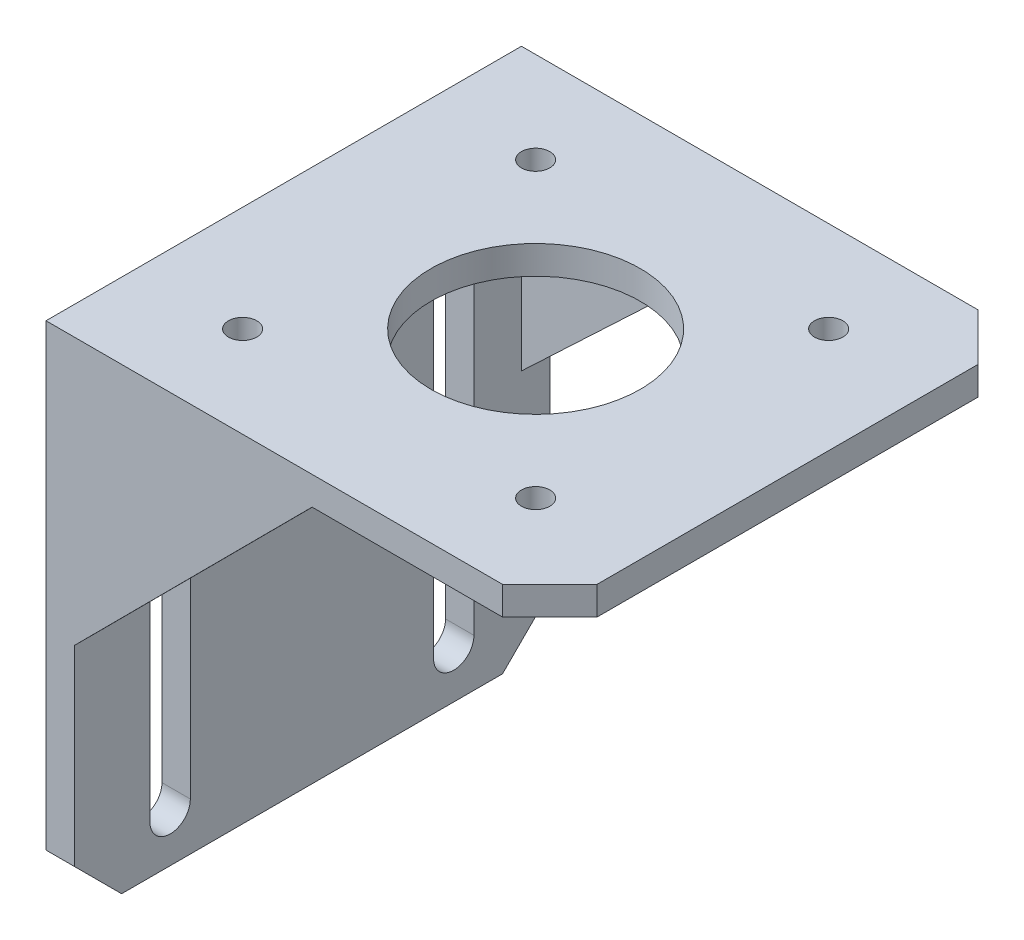
ISO-10303-21;
HEADER;
FILE_DESCRIPTION(('STEP AP214'),'2;1');
FILE_NAME('part.step','',(''),(''),'','','');
FILE_SCHEMA(('AUTOMOTIVE_DESIGN { 1 0 10303 214 1 1 1 1 }'));
ENDSEC;
DATA;
#1=APPLICATION_CONTEXT('core data for automotive mechanical design processes');
#2=APPLICATION_PROTOCOL_DEFINITION('international standard','automotive_design',2000,#1);
#3=PRODUCT_CONTEXT('',#1,'mechanical');
#4=PRODUCT('Part','Part','',(#3));
#5=PRODUCT_RELATED_PRODUCT_CATEGORY('part','',(#4));
#6=PRODUCT_DEFINITION_FORMATION('','',#4);
#7=PRODUCT_DEFINITION_CONTEXT('part definition',#1,'design');
#8=PRODUCT_DEFINITION('design','',#6,#7);
#9=PRODUCT_DEFINITION_SHAPE('','',#8);
#10=(LENGTH_UNIT() NAMED_UNIT(*) SI_UNIT(.MILLI.,.METRE.));
#11=(NAMED_UNIT(*) PLANE_ANGLE_UNIT() SI_UNIT($,.RADIAN.));
#12=(NAMED_UNIT(*) SI_UNIT($,.STERADIAN.) SOLID_ANGLE_UNIT());
#13=UNCERTAINTY_MEASURE_WITH_UNIT(LENGTH_MEASURE(1.E-05),#10,'distance_accuracy_value','');
#14=(GEOMETRIC_REPRESENTATION_CONTEXT(3) GLOBAL_UNCERTAINTY_ASSIGNED_CONTEXT((#13)) GLOBAL_UNIT_ASSIGNED_CONTEXT((#10,
#11,#12)) REPRESENTATION_CONTEXT('',''));
#15=CARTESIAN_POINT('',(0.,0.,0.));
#16=DIRECTION('',(0.,0.,1.));
#17=DIRECTION('',(1.,0.,0.));
#18=AXIS2_PLACEMENT_3D('',#15,#16,#17);
#19=CARTESIAN_POINT('',(3.,0.,0.));
#20=DIRECTION('',(1.,0.,0.));
#21=DIRECTION('',(0.,0.,-1.));
#22=AXIS2_PLACEMENT_3D('',#19,#20,#21);
#23=PLANE('',#22);
#24=DIRECTION('',(0.,0.,-1.));
#25=VECTOR('',#24,1.);
#26=CARTESIAN_POINT('',(3.,-29.863798217859,14.9988582977588));
#27=LINE('',#26,#25);
#28=CARTESIAN_POINT('',(3.,-29.863798217859,9.99885829775879));
#29=VERTEX_POINT('',#28);
#30=CARTESIAN_POINT('',(3.,-29.863798217859,-30.3011417022412));
#31=VERTEX_POINT('',#30);
#32=EDGE_CURVE('E309',#29,#31,#27,.T.);
#33=ORIENTED_EDGE('',*,*,#32,.T.);
#34=DIRECTION('',(0.,-0.707106781186547,0.707106781186549));
#35=VECTOR('',#34,1.);
#36=CARTESIAN_POINT('',(3.,-30.0824699600502,-30.0824699600501));
#37=LINE('',#36,#35);
#38=CARTESIAN_POINT('',(3.,-24.863798217859,-35.3011417022412));
#39=VERTEX_POINT('',#38);
#40=EDGE_CURVE('E11',#31,#39,#37,.F.);
#41=ORIENTED_EDGE('',*,*,#40,.T.);
#42=DIRECTION('',(0.,1.,0.));
#43=VECTOR('',#42,1.);
#44=CARTESIAN_POINT('',(3.,23.636201782141,-35.3011417022412));
#45=LINE('',#44,#43);
#46=CARTESIAN_POINT('',(3.,-3.113798217859,-35.3011417022412));
#47=VERTEX_POINT('',#46);
#48=EDGE_CURVE('E312',#39,#47,#45,.T.);
#49=ORIENTED_EDGE('',*,*,#48,.T.);
#50=DIRECTION('',(0.,0.,-1.));
#51=VECTOR('',#50,1.);
#52=CARTESIAN_POINT('',(3.,-3.11379821785901,-32.3011417022412));
#53=LINE('',#52,#51);
#54=CARTESIAN_POINT('',(3.,-3.11379821785901,-32.3011417022412));
#55=VERTEX_POINT('',#54);
#56=EDGE_CURVE('E196',#55,#47,#53,.T.);
#57=ORIENTED_EDGE('',*,*,#56,.F.);
#58=DIRECTION('',(0.,-1.,0.));
#59=VECTOR('',#58,1.);
#60=CARTESIAN_POINT('',(3.,20.636201782141,-32.3011417022412));
#61=LINE('',#60,#59);
#62=CARTESIAN_POINT('',(3.,20.636201782141,-32.3011417022412));
#63=VERTEX_POINT('',#62);
#64=EDGE_CURVE('E197',#63,#55,#61,.T.);
#65=ORIENTED_EDGE('',*,*,#64,.F.);
#66=DIRECTION('',(0.,0.,-1.));
#67=VECTOR('',#66,1.);
#68=CARTESIAN_POINT('',(3.,20.636201782141,14.9988582977588));
#69=LINE('',#68,#67);
#70=CARTESIAN_POINT('',(3.,20.636201782141,11.9988582977588));
#71=VERTEX_POINT('',#70);
#72=EDGE_CURVE('E208',#71,#63,#69,.T.);
#73=ORIENTED_EDGE('',*,*,#72,.F.);
#74=DIRECTION('',(0.,-1.,0.));
#75=VECTOR('',#74,1.);
#76=CARTESIAN_POINT('',(3.,20.636201782141,11.9988582977588));
#77=LINE('',#76,#75);
#78=CARTESIAN_POINT('',(3.,-4.613798217859,11.9988582977588));
#79=VERTEX_POINT('',#78);
#80=EDGE_CURVE('E221',#71,#79,#77,.T.);
#81=ORIENTED_EDGE('',*,*,#80,.T.);
#82=DIRECTION('',(0.,0.,1.));
#83=VECTOR('',#82,1.);
#84=CARTESIAN_POINT('',(3.,-4.613798217859,11.9988582977588));
#85=LINE('',#84,#83);
#86=CARTESIAN_POINT('',(3.,-4.613798217859,14.9988582977588));
#87=VERTEX_POINT('',#86);
#88=EDGE_CURVE('E226',#79,#87,#85,.T.);
#89=ORIENTED_EDGE('',*,*,#88,.T.);
#90=DIRECTION('',(0.,-1.,0.));
#91=VECTOR('',#90,1.);
#92=CARTESIAN_POINT('',(3.,23.636201782141,14.9988582977588));
#93=LINE('',#92,#91);
#94=CARTESIAN_POINT('',(3.,-24.863798217859,14.9988582977588));
#95=VERTEX_POINT('',#94);
#96=EDGE_CURVE('E306',#87,#95,#93,.T.);
#97=ORIENTED_EDGE('',*,*,#96,.T.);
#98=DIRECTION('',(0.,0.707106781186549,0.707106781186546));
#99=VECTOR('',#98,1.);
#100=CARTESIAN_POINT('',(3.,-19.9313282578088,19.9313282578089));
#101=LINE('',#100,#99);
#102=EDGE_CURVE('E353',#95,#29,#101,.F.);
#103=ORIENTED_EDGE('',*,*,#102,.T.);
#104=EDGE_LOOP('',(#33,#41,#49,#57,#65,#73,#81,#89,#97,#103));
#105=FACE_BOUND('',#104,.T.);
#106=DIRECTION('',(0.,-1.,0.));
#107=VECTOR('',#106,1.);
#108=CARTESIAN_POINT('',(3.,18.3151534002033,-23.0011417022412));
#109=LINE('',#108,#107);
#110=CARTESIAN_POINT('',(3.,18.3151534002033,-23.0011417022412));
#111=VERTEX_POINT('',#110);
#112=CARTESIAN_POINT('',(3.,-24.8184175519282,-23.0011417022412));
#113=VERTEX_POINT('',#112);
#114=EDGE_CURVE('E277',#111,#113,#109,.T.);
#115=ORIENTED_EDGE('',*,*,#114,.F.);
#116=CARTESIAN_POINT('',(3.,18.3151534002033,-25.1361417022412));
#117=DIRECTION('',(1.,0.,0.));
#118=DIRECTION('',(0.,0.,-1.));
#119=AXIS2_PLACEMENT_3D('',#116,#117,#118);
#120=CIRCLE('',#119,2.135);
#121=CARTESIAN_POINT('',(3.,18.3151534002033,-27.2711417022412));
#122=VERTEX_POINT('',#121);
#123=EDGE_CURVE('E275',#122,#111,#120,.T.);
#124=ORIENTED_EDGE('',*,*,#123,.F.);
#125=DIRECTION('',(0.,1.,0.));
#126=VECTOR('',#125,1.);
#127=CARTESIAN_POINT('',(3.,18.3151534002033,-27.2711417022412));
#128=LINE('',#127,#126);
#129=CARTESIAN_POINT('',(3.,-24.8184175519282,-27.2711417022412));
#130=VERTEX_POINT('',#129);
#131=EDGE_CURVE('E283',#130,#122,#128,.T.);
#132=ORIENTED_EDGE('',*,*,#131,.F.);
#133=CARTESIAN_POINT('',(3.,-24.8184175519282,-25.1361417022412));
#134=DIRECTION('',(1.,0.,0.));
#135=DIRECTION('',(0.,0.,-1.));
#136=AXIS2_PLACEMENT_3D('',#133,#134,#135);
#137=CIRCLE('',#136,2.135);
#138=EDGE_CURVE('E280',#113,#130,#137,.T.);
#139=ORIENTED_EDGE('',*,*,#138,.F.);
#140=EDGE_LOOP('',(#115,#124,#132,#139));
#141=FACE_BOUND('',#140,.T.);
#142=DIRECTION('',(0.,-1.,0.));
#143=VECTOR('',#142,1.);
#144=CARTESIAN_POINT('',(3.,-24.8184175519282,6.99885829775877));
#145=LINE('',#144,#143);
#146=CARTESIAN_POINT('',(3.,18.3151534002033,6.99885829775877));
#147=VERTEX_POINT('',#146);
#148=CARTESIAN_POINT('',(3.,-24.8184175519282,6.99885829775877));
#149=VERTEX_POINT('',#148);
#150=EDGE_CURVE('E246',#147,#149,#145,.T.);
#151=ORIENTED_EDGE('',*,*,#150,.F.);
#152=CARTESIAN_POINT('',(3.,18.3151534002033,4.86385829775877));
#153=DIRECTION('',(1.,0.,0.));
#154=DIRECTION('',(0.,0.,1.));
#155=AXIS2_PLACEMENT_3D('',#152,#153,#154);
#156=CIRCLE('',#155,2.135);
#157=CARTESIAN_POINT('',(3.,18.3151534002033,2.72885829775877));
#158=VERTEX_POINT('',#157);
#159=EDGE_CURVE('E244',#158,#147,#156,.T.);
#160=ORIENTED_EDGE('',*,*,#159,.F.);
#161=DIRECTION('',(0.,1.,0.));
#162=VECTOR('',#161,1.);
#163=CARTESIAN_POINT('',(3.,18.3151534002033,2.72885829775877));
#164=LINE('',#163,#162);
#165=CARTESIAN_POINT('',(3.,-24.8184175519282,2.72885829775877));
#166=VERTEX_POINT('',#165);
#167=EDGE_CURVE('E252',#166,#158,#164,.T.);
#168=ORIENTED_EDGE('',*,*,#167,.F.);
#169=CARTESIAN_POINT('',(3.,-24.8184175519282,4.86385829775877));
#170=DIRECTION('',(1.,0.,0.));
#171=DIRECTION('',(0.,0.,-1.));
#172=AXIS2_PLACEMENT_3D('',#169,#170,#171);
#173=CIRCLE('',#172,2.135);
#174=EDGE_CURVE('E249',#149,#166,#173,.T.);
#175=ORIENTED_EDGE('',*,*,#174,.F.);
#176=EDGE_LOOP('',(#151,#160,#168,#175));
#177=FACE_BOUND('',#176,.T.);
#178=ADVANCED_FACE('F35',(#105,#141,#177),#23,.T.);
#179=CARTESIAN_POINT('',(0.,0.,0.));
#180=DIRECTION('',(1.,0.,0.));
#181=DIRECTION('',(0.,0.,-1.));
#182=AXIS2_PLACEMENT_3D('',#179,#180,#181);
#183=PLANE('',#182);
#184=CARTESIAN_POINT('',(0.,18.3151534002033,-25.1361417022412));
#185=DIRECTION('',(1.,0.,0.));
#186=DIRECTION('',(0.,0.,-1.));
#187=AXIS2_PLACEMENT_3D('',#184,#185,#186);
#188=CIRCLE('',#187,2.135);
#189=CARTESIAN_POINT('',(0.,18.3151534002033,-27.2711417022412));
#190=VERTEX_POINT('',#189);
#191=CARTESIAN_POINT('',(0.,18.3151534002033,-23.0011417022412));
#192=VERTEX_POINT('',#191);
#193=EDGE_CURVE('E274',#190,#192,#188,.T.);
#194=ORIENTED_EDGE('',*,*,#193,.T.);
#195=DIRECTION('',(0.,-1.,0.));
#196=VECTOR('',#195,1.);
#197=CARTESIAN_POINT('',(0.,18.3151534002033,-23.0011417022412));
#198=LINE('',#197,#196);
#199=CARTESIAN_POINT('',(0.,-24.8184175519282,-23.0011417022412));
#200=VERTEX_POINT('',#199);
#201=EDGE_CURVE('E288',#192,#200,#198,.T.);
#202=ORIENTED_EDGE('',*,*,#201,.T.);
#203=CARTESIAN_POINT('',(0.,-24.8184175519282,-25.1361417022412));
#204=DIRECTION('',(1.,0.,0.));
#205=DIRECTION('',(0.,0.,-1.));
#206=AXIS2_PLACEMENT_3D('',#203,#204,#205);
#207=CIRCLE('',#206,2.135);
#208=CARTESIAN_POINT('',(0.,-24.8184175519282,-27.2711417022412));
#209=VERTEX_POINT('',#208);
#210=EDGE_CURVE('E291',#200,#209,#207,.T.);
#211=ORIENTED_EDGE('',*,*,#210,.T.);
#212=DIRECTION('',(0.,1.,0.));
#213=VECTOR('',#212,1.);
#214=CARTESIAN_POINT('',(0.,18.3151534002033,-27.2711417022412));
#215=LINE('',#214,#213);
#216=EDGE_CURVE('E278',#209,#190,#215,.T.);
#217=ORIENTED_EDGE('',*,*,#216,.T.);
#218=EDGE_LOOP('',(#194,#202,#211,#217));
#219=FACE_BOUND('',#218,.T.);
#220=DIRECTION('',(0.,1.,0.));
#221=VECTOR('',#220,1.);
#222=CARTESIAN_POINT('',(0.,23.636201782141,-35.3011417022412));
#223=LINE('',#222,#221);
#224=CARTESIAN_POINT('',(0.,-24.863798217859,-35.3011417022412));
#225=VERTEX_POINT('',#224);
#226=CARTESIAN_POINT('',(0.,23.636201782141,-35.3011417022412));
#227=VERTEX_POINT('',#226);
#228=EDGE_CURVE('E319',#225,#227,#223,.T.);
#229=ORIENTED_EDGE('',*,*,#228,.F.);
#230=DIRECTION('',(0.,0.707106781186547,-0.707106781186549));
#231=VECTOR('',#230,1.);
#232=CARTESIAN_POINT('',(0.,-24.863798217859,-35.3011417022412));
#233=LINE('',#232,#231);
#234=CARTESIAN_POINT('',(0.,-29.863798217859,-30.3011417022412));
#235=VERTEX_POINT('',#234);
#236=EDGE_CURVE('E57',#225,#235,#233,.F.);
#237=ORIENTED_EDGE('',*,*,#236,.T.);
#238=DIRECTION('',(0.,0.,-1.));
#239=VECTOR('',#238,1.);
#240=CARTESIAN_POINT('',(0.,-29.863798217859,14.9988582977588));
#241=LINE('',#240,#239);
#242=CARTESIAN_POINT('',(0.,-29.863798217859,9.99885829775879));
#243=VERTEX_POINT('',#242);
#244=EDGE_CURVE('E317',#243,#235,#241,.T.);
#245=ORIENTED_EDGE('',*,*,#244,.F.);
#246=DIRECTION('',(0.,-0.707106781186549,-0.707106781186546));
#247=VECTOR('',#246,1.);
#248=CARTESIAN_POINT('',(0.,-29.863798217859,9.99885829775879));
#249=LINE('',#248,#247);
#250=CARTESIAN_POINT('',(0.,-24.863798217859,14.9988582977588));
#251=VERTEX_POINT('',#250);
#252=EDGE_CURVE('E349',#243,#251,#249,.F.);
#253=ORIENTED_EDGE('',*,*,#252,.T.);
#254=DIRECTION('',(0.,-1.,0.));
#255=VECTOR('',#254,1.);
#256=CARTESIAN_POINT('',(0.,23.636201782141,14.9988582977588));
#257=LINE('',#256,#255);
#258=CARTESIAN_POINT('',(0.,23.636201782141,14.9988582977588));
#259=VERTEX_POINT('',#258);
#260=EDGE_CURVE('E305',#259,#251,#257,.T.);
#261=ORIENTED_EDGE('',*,*,#260,.F.);
#262=DIRECTION('',(0.,0.,1.));
#263=VECTOR('',#262,1.);
#264=CARTESIAN_POINT('',(0.,23.636201782141,14.9988582977588));
#265=LINE('',#264,#263);
#266=EDGE_CURVE('E310',#227,#259,#265,.T.);
#267=ORIENTED_EDGE('',*,*,#266,.F.);
#268=EDGE_LOOP('',(#229,#237,#245,#253,#261,#267));
#269=FACE_BOUND('',#268,.T.);
#270=CARTESIAN_POINT('',(0.,18.3151534002033,4.86385829775877));
#271=DIRECTION('',(1.,0.,0.));
#272=DIRECTION('',(0.,0.,1.));
#273=AXIS2_PLACEMENT_3D('',#270,#271,#272);
#274=CIRCLE('',#273,2.135);
#275=CARTESIAN_POINT('',(0.,18.3151534002033,2.72885829775877));
#276=VERTEX_POINT('',#275);
#277=CARTESIAN_POINT('',(0.,18.3151534002033,6.99885829775877));
#278=VERTEX_POINT('',#277);
#279=EDGE_CURVE('E243',#276,#278,#274,.T.);
#280=ORIENTED_EDGE('',*,*,#279,.T.);
#281=DIRECTION('',(0.,-1.,0.));
#282=VECTOR('',#281,1.);
#283=CARTESIAN_POINT('',(0.,-24.8184175519282,6.99885829775877));
#284=LINE('',#283,#282);
#285=CARTESIAN_POINT('',(0.,-24.8184175519282,6.99885829775877));
#286=VERTEX_POINT('',#285);
#287=EDGE_CURVE('E257',#278,#286,#284,.T.);
#288=ORIENTED_EDGE('',*,*,#287,.T.);
#289=CARTESIAN_POINT('',(0.,-24.8184175519282,4.86385829775877));
#290=DIRECTION('',(1.,0.,0.));
#291=DIRECTION('',(0.,0.,-1.));
#292=AXIS2_PLACEMENT_3D('',#289,#290,#291);
#293=CIRCLE('',#292,2.135);
#294=CARTESIAN_POINT('',(0.,-24.8184175519282,2.72885829775877));
#295=VERTEX_POINT('',#294);
#296=EDGE_CURVE('E260',#286,#295,#293,.T.);
#297=ORIENTED_EDGE('',*,*,#296,.T.);
#298=DIRECTION('',(0.,1.,0.));
#299=VECTOR('',#298,1.);
#300=CARTESIAN_POINT('',(0.,18.3151534002033,2.72885829775877));
#301=LINE('',#300,#299);
#302=EDGE_CURVE('E247',#295,#276,#301,.T.);
#303=ORIENTED_EDGE('',*,*,#302,.T.);
#304=EDGE_LOOP('',(#280,#288,#297,#303));
#305=FACE_BOUND('',#304,.T.);
#306=ADVANCED_FACE('F366',(#219,#269,#305),#183,.F.);
#307=CARTESIAN_POINT('',(3.,23.636201782141,14.9988582977588));
#308=DIRECTION('',(0.,0.,-1.));
#309=DIRECTION('',(0.,1.,0.));
#310=AXIS2_PLACEMENT_3D('',#307,#308,#309);
#311=PLANE('',#310);
#312=ORIENTED_EDGE('',*,*,#260,.T.);
#313=DIRECTION('',(1.,0.,0.));
#314=VECTOR('',#313,1.);
#315=CARTESIAN_POINT('',(3.,-24.863798217859,14.9988582977588));
#316=LINE('',#315,#314);
#317=EDGE_CURVE('E351',#251,#95,#316,.T.);
#318=ORIENTED_EDGE('',*,*,#317,.T.);
#319=ORIENTED_EDGE('',*,*,#96,.F.);
#320=DIRECTION('',(0.705702402452248,0.708508376219453,0.));
#321=VECTOR('',#320,1.);
#322=CARTESIAN_POINT('',(3.,-4.613798217859,14.9988582977588));
#323=LINE('',#322,#321);
#324=CARTESIAN_POINT('',(28.15,20.636201782141,14.9988582977588));
#325=VERTEX_POINT('',#324);
#326=EDGE_CURVE('E217',#87,#325,#323,.T.);
#327=ORIENTED_EDGE('',*,*,#326,.T.);
#328=DIRECTION('',(-1.,0.,0.));
#329=VECTOR('',#328,1.);
#330=CARTESIAN_POINT('',(53.3,20.636201782141,14.9988582977588));
#331=LINE('',#330,#329);
#332=CARTESIAN_POINT('',(48.3,20.636201782141,14.9988582977588));
#333=VERTEX_POINT('',#332);
#334=EDGE_CURVE('E241',#333,#325,#331,.T.);
#335=ORIENTED_EDGE('',*,*,#334,.F.);
#336=DIRECTION('',(0.,1.,0.));
#337=VECTOR('',#336,1.);
#338=CARTESIAN_POINT('',(48.3,23.636201782141,14.9988582977588));
#339=LINE('',#338,#337);
#340=CARTESIAN_POINT('',(48.3,23.636201782141,14.9988582977588));
#341=VERTEX_POINT('',#340);
#342=EDGE_CURVE('E342',#333,#341,#339,.T.);
#343=ORIENTED_EDGE('',*,*,#342,.T.);
#344=DIRECTION('',(-1.,0.,0.));
#345=VECTOR('',#344,1.);
#346=CARTESIAN_POINT('',(3.,23.636201782141,14.9988582977588));
#347=LINE('',#346,#345);
#348=EDGE_CURVE('E314',#341,#259,#347,.T.);
#349=ORIENTED_EDGE('',*,*,#348,.T.);
#350=EDGE_LOOP('',(#312,#318,#319,#327,#335,#343,#349));
#351=FACE_BOUND('',#350,.T.);
#352=ADVANCED_FACE('F387',(#351),#311,.F.);
#353=CARTESIAN_POINT('',(3.,-29.863798217859,14.9988582977588));
#354=DIRECTION('',(0.,1.,0.));
#355=DIRECTION('',(0.,0.,1.));
#356=AXIS2_PLACEMENT_3D('',#353,#354,#355);
#357=PLANE('',#356);
#358=ORIENTED_EDGE('',*,*,#244,.T.);
#359=DIRECTION('',(1.,0.,0.));
#360=VECTOR('',#359,1.);
#361=CARTESIAN_POINT('',(3.,-29.863798217859,-30.3011417022412));
#362=LINE('',#361,#360);
#363=EDGE_CURVE('E43',#235,#31,#362,.T.);
#364=ORIENTED_EDGE('',*,*,#363,.T.);
#365=ORIENTED_EDGE('',*,*,#32,.F.);
#366=DIRECTION('',(-1.,0.,0.));
#367=VECTOR('',#366,1.);
#368=CARTESIAN_POINT('',(3.,-29.863798217859,9.99885829775879));
#369=LINE('',#368,#367);
#370=EDGE_CURVE('E346',#29,#243,#369,.T.);
#371=ORIENTED_EDGE('',*,*,#370,.T.);
#372=EDGE_LOOP('',(#358,#364,#365,#371));
#373=FACE_BOUND('',#372,.T.);
#374=ADVANCED_FACE('F423',(#373),#357,.F.);
#375=CARTESIAN_POINT('',(3.,23.636201782141,-35.3011417022412));
#376=DIRECTION('',(0.,0.,1.));
#377=DIRECTION('',(0.,-1.,0.));
#378=AXIS2_PLACEMENT_3D('',#375,#376,#377);
#379=PLANE('',#378);
#380=ORIENTED_EDGE('',*,*,#48,.F.);
#381=DIRECTION('',(-1.,0.,0.));
#382=VECTOR('',#381,1.);
#383=CARTESIAN_POINT('',(3.,-24.863798217859,-35.3011417022412));
#384=LINE('',#383,#382);
#385=EDGE_CURVE('E355',#39,#225,#384,.T.);
#386=ORIENTED_EDGE('',*,*,#385,.T.);
#387=ORIENTED_EDGE('',*,*,#228,.T.);
#388=DIRECTION('',(-1.,0.,0.));
#389=VECTOR('',#388,1.);
#390=CARTESIAN_POINT('',(3.,23.636201782141,-35.3011417022412));
#391=LINE('',#390,#389);
#392=CARTESIAN_POINT('',(48.3,23.636201782141,-35.3011417022412));
#393=VERTEX_POINT('',#392);
#394=EDGE_CURVE('E324',#393,#227,#391,.T.);
#395=ORIENTED_EDGE('',*,*,#394,.F.);
#396=DIRECTION('',(0.,-1.,0.));
#397=VECTOR('',#396,1.);
#398=CARTESIAN_POINT('',(48.3,20.636201782141,-35.3011417022412));
#399=LINE('',#398,#397);
#400=CARTESIAN_POINT('',(48.3,20.636201782141,-35.3011417022412));
#401=VERTEX_POINT('',#400);
#402=EDGE_CURVE('E332',#393,#401,#399,.T.);
#403=ORIENTED_EDGE('',*,*,#402,.T.);
#404=DIRECTION('',(-1.,0.,0.));
#405=VECTOR('',#404,1.);
#406=CARTESIAN_POINT('',(53.3,20.636201782141,-35.3011417022412));
#407=LINE('',#406,#405);
#408=CARTESIAN_POINT('',(28.15,20.636201782141,-35.3011417022412));
#409=VERTEX_POINT('',#408);
#410=EDGE_CURVE('E238',#401,#409,#407,.T.);
#411=ORIENTED_EDGE('',*,*,#410,.T.);
#412=DIRECTION('',(-0.727053236752637,-0.686581088384696,0.));
#413=VECTOR('',#412,1.);
#414=CARTESIAN_POINT('',(28.15,20.636201782141,-35.3011417022412));
#415=LINE('',#414,#413);
#416=EDGE_CURVE('E192',#409,#47,#415,.T.);
#417=ORIENTED_EDGE('',*,*,#416,.T.);
#418=EDGE_LOOP('',(#380,#386,#387,#395,#403,#411,#417));
#419=FACE_BOUND('',#418,.T.);
#420=ADVANCED_FACE('F361',(#419),#379,.F.);
#421=CARTESIAN_POINT('',(3.,23.636201782141,14.9988582977588));
#422=DIRECTION('',(0.,-1.,0.));
#423=DIRECTION('',(0.,0.,-1.));
#424=AXIS2_PLACEMENT_3D('',#421,#422,#423);
#425=PLANE('',#424);
#426=CARTESIAN_POINT('',(42.15,23.636201782141,5.34885829775878));
#427=DIRECTION('',(0.,1.,0.));
#428=DIRECTION('',(0.,0.,1.));
#429=AXIS2_PLACEMENT_3D('',#426,#427,#428);
#430=CIRCLE('',#429,1.5);
#431=CARTESIAN_POINT('',(42.15,23.636201782141,6.84885829775878));
#432=VERTEX_POINT('',#431);
#433=EDGE_CURVE('E643',#432,#432,#430,.T.);
#434=ORIENTED_EDGE('',*,*,#433,.F.);
#435=EDGE_LOOP('',(#434));
#436=FACE_BOUND('',#435,.T.);
#437=CARTESIAN_POINT('',(11.15,23.636201782141,-25.6511417022412));
#438=DIRECTION('',(0.,1.,0.));
#439=DIRECTION('',(0.,0.,1.));
#440=AXIS2_PLACEMENT_3D('',#437,#438,#439);
#441=CIRCLE('',#440,1.5);
#442=CARTESIAN_POINT('',(11.15,23.636201782141,-24.1511417022412));
#443=VERTEX_POINT('',#442);
#444=EDGE_CURVE('E648',#443,#443,#441,.T.);
#445=ORIENTED_EDGE('',*,*,#444,.F.);
#446=EDGE_LOOP('',(#445));
#447=FACE_BOUND('',#446,.T.);
#448=CARTESIAN_POINT('',(11.15,23.636201782141,5.34885829775878));
#449=DIRECTION('',(0.,1.,0.));
#450=DIRECTION('',(0.,0.,1.));
#451=AXIS2_PLACEMENT_3D('',#448,#449,#450);
#452=CIRCLE('',#451,1.5);
#453=CARTESIAN_POINT('',(11.15,23.636201782141,6.84885829775878));
#454=VERTEX_POINT('',#453);
#455=EDGE_CURVE('E664',#454,#454,#452,.T.);
#456=ORIENTED_EDGE('',*,*,#455,.F.);
#457=EDGE_LOOP('',(#456));
#458=FACE_BOUND('',#457,.T.);
#459=CARTESIAN_POINT('',(26.65,23.636201782141,-10.1511417022412));
#460=DIRECTION('',(0.,1.,0.));
#461=DIRECTION('',(0.,0.,1.));
#462=AXIS2_PLACEMENT_3D('',#459,#460,#461);
#463=CIRCLE('',#462,11.075);
#464=CARTESIAN_POINT('',(26.65,23.636201782141,0.923858297758776));
#465=VERTEX_POINT('',#464);
#466=EDGE_CURVE('E673',#465,#465,#463,.T.);
#467=ORIENTED_EDGE('',*,*,#466,.F.);
#468=EDGE_LOOP('',(#467));
#469=FACE_BOUND('',#468,.T.);
#470=CARTESIAN_POINT('',(42.15,23.636201782141,-25.6511417022412));
#471=DIRECTION('',(0.,1.,0.));
#472=DIRECTION('',(0.,0.,1.));
#473=AXIS2_PLACEMENT_3D('',#470,#471,#472);
#474=CIRCLE('',#473,1.5);
#475=CARTESIAN_POINT('',(42.15,23.636201782141,-24.1511417022412));
#476=VERTEX_POINT('',#475);
#477=EDGE_CURVE('E213',#476,#476,#474,.T.);
#478=ORIENTED_EDGE('',*,*,#477,.F.);
#479=EDGE_LOOP('',(#478));
#480=FACE_BOUND('',#479,.T.);
#481=ORIENTED_EDGE('',*,*,#348,.F.);
#482=DIRECTION('',(0.707106781186549,0.,-0.707106781186547));
#483=VECTOR('',#482,1.);
#484=CARTESIAN_POINT('',(53.3,23.636201782141,9.99885829775878));
#485=LINE('',#484,#483);
#486=CARTESIAN_POINT('',(53.3,23.636201782141,9.99885829775878));
#487=VERTEX_POINT('',#486);
#488=EDGE_CURVE('E344',#341,#487,#485,.T.);
#489=ORIENTED_EDGE('',*,*,#488,.T.);
#490=DIRECTION('',(0.,0.,1.));
#491=VECTOR('',#490,1.);
#492=CARTESIAN_POINT('',(53.3,23.636201782141,14.9988582977588));
#493=LINE('',#492,#491);
#494=CARTESIAN_POINT('',(53.3,23.636201782141,-30.3011417022412));
#495=VERTEX_POINT('',#494);
#496=EDGE_CURVE('E235',#495,#487,#493,.T.);
#497=ORIENTED_EDGE('',*,*,#496,.F.);
#498=DIRECTION('',(-0.70710678118655,0.,-0.707106781186546));
#499=VECTOR('',#498,1.);
#500=CARTESIAN_POINT('',(53.3,23.636201782141,-30.3011417022412));
#501=LINE('',#500,#499);
#502=EDGE_CURVE('E330',#495,#393,#501,.T.);
#503=ORIENTED_EDGE('',*,*,#502,.T.);
#504=ORIENTED_EDGE('',*,*,#394,.T.);
#505=ORIENTED_EDGE('',*,*,#266,.T.);
#506=EDGE_LOOP('',(#481,#489,#497,#503,#504,#505));
#507=FACE_BOUND('',#506,.T.);
#508=ADVANCED_FACE('F371',(#436,#447,#458,#469,#480,#507),#425,.F.);
#509=CARTESIAN_POINT('',(3.,18.3151534002033,-25.1361417022412));
#510=DIRECTION('',(-1.,0.,0.));
#511=DIRECTION('',(0.,0.,1.));
#512=AXIS2_PLACEMENT_3D('',#509,#510,#511);
#513=CYLINDRICAL_SURFACE('',#512,2.135);
#514=ORIENTED_EDGE('',*,*,#193,.F.);
#515=DIRECTION('',(-1.,0.,0.));
#516=VECTOR('',#515,1.);
#517=CARTESIAN_POINT('',(3.,18.3151534002033,-27.2711417022412));
#518=LINE('',#517,#516);
#519=EDGE_CURVE('E285',#122,#190,#518,.T.);
#520=ORIENTED_EDGE('',*,*,#519,.F.);
#521=ORIENTED_EDGE('',*,*,#123,.T.);
#522=DIRECTION('',(-1.,0.,0.));
#523=VECTOR('',#522,1.);
#524=CARTESIAN_POINT('',(3.,18.3151534002033,-23.0011417022412));
#525=LINE('',#524,#523);
#526=EDGE_CURVE('E302',#111,#192,#525,.T.);
#527=ORIENTED_EDGE('',*,*,#526,.T.);
#528=EDGE_LOOP('',(#514,#520,#521,#527));
#529=FACE_BOUND('',#528,.T.);
#530=ADVANCED_FACE('F415',(#529),#513,.F.);
#531=CARTESIAN_POINT('',(3.,18.3151534002033,-23.0011417022412));
#532=DIRECTION('',(0.,0.,-1.));
#533=DIRECTION('',(-1.,0.,0.));
#534=AXIS2_PLACEMENT_3D('',#531,#532,#533);
#535=PLANE('',#534);
#536=ORIENTED_EDGE('',*,*,#201,.F.);
#537=ORIENTED_EDGE('',*,*,#526,.F.);
#538=ORIENTED_EDGE('',*,*,#114,.T.);
#539=DIRECTION('',(-1.,0.,0.));
#540=VECTOR('',#539,1.);
#541=CARTESIAN_POINT('',(3.,-24.8184175519282,-23.0011417022412));
#542=LINE('',#541,#540);
#543=EDGE_CURVE('E300',#113,#200,#542,.T.);
#544=ORIENTED_EDGE('',*,*,#543,.T.);
#545=EDGE_LOOP('',(#536,#537,#538,#544));
#546=FACE_BOUND('',#545,.T.);
#547=ADVANCED_FACE('F488',(#546),#535,.T.);
#548=CARTESIAN_POINT('',(3.,-24.8184175519282,-25.1361417022412));
#549=DIRECTION('',(-1.,0.,0.));
#550=DIRECTION('',(0.,0.,1.));
#551=AXIS2_PLACEMENT_3D('',#548,#549,#550);
#552=CYLINDRICAL_SURFACE('',#551,2.135);
#553=ORIENTED_EDGE('',*,*,#210,.F.);
#554=ORIENTED_EDGE('',*,*,#543,.F.);
#555=ORIENTED_EDGE('',*,*,#138,.T.);
#556=DIRECTION('',(-1.,0.,0.));
#557=VECTOR('',#556,1.);
#558=CARTESIAN_POINT('',(3.,-24.8184175519282,-27.2711417022412));
#559=LINE('',#558,#557);
#560=EDGE_CURVE('E298',#130,#209,#559,.T.);
#561=ORIENTED_EDGE('',*,*,#560,.T.);
#562=EDGE_LOOP('',(#553,#554,#555,#561));
#563=FACE_BOUND('',#562,.T.);
#564=ADVANCED_FACE('F495',(#563),#552,.F.);
#565=CARTESIAN_POINT('',(3.,18.3151534002033,-27.2711417022412));
#566=DIRECTION('',(0.,0.,1.));
#567=DIRECTION('',(1.,0.,0.));
#568=AXIS2_PLACEMENT_3D('',#565,#566,#567);
#569=PLANE('',#568);
#570=ORIENTED_EDGE('',*,*,#216,.F.);
#571=ORIENTED_EDGE('',*,*,#560,.F.);
#572=ORIENTED_EDGE('',*,*,#131,.T.);
#573=ORIENTED_EDGE('',*,*,#519,.T.);
#574=EDGE_LOOP('',(#570,#571,#572,#573));
#575=FACE_BOUND('',#574,.T.);
#576=ADVANCED_FACE('F502',(#575),#569,.T.);
#577=CARTESIAN_POINT('',(3.,18.3151534002033,4.86385829775877));
#578=DIRECTION('',(-1.,0.,0.));
#579=DIRECTION('',(0.,0.,1.));
#580=AXIS2_PLACEMENT_3D('',#577,#578,#579);
#581=CYLINDRICAL_SURFACE('',#580,2.135);
#582=ORIENTED_EDGE('',*,*,#279,.F.);
#583=DIRECTION('',(-1.,0.,0.));
#584=VECTOR('',#583,1.);
#585=CARTESIAN_POINT('',(3.,18.3151534002033,2.72885829775877));
#586=LINE('',#585,#584);
#587=EDGE_CURVE('E254',#158,#276,#586,.T.);
#588=ORIENTED_EDGE('',*,*,#587,.F.);
#589=ORIENTED_EDGE('',*,*,#159,.T.);
#590=DIRECTION('',(-1.,0.,0.));
#591=VECTOR('',#590,1.);
#592=CARTESIAN_POINT('',(3.,18.3151534002033,6.99885829775877));
#593=LINE('',#592,#591);
#594=EDGE_CURVE('E271',#147,#278,#593,.T.);
#595=ORIENTED_EDGE('',*,*,#594,.T.);
#596=EDGE_LOOP('',(#582,#588,#589,#595));
#597=FACE_BOUND('',#596,.T.);
#598=ADVANCED_FACE('F510',(#597),#581,.F.);
#599=CARTESIAN_POINT('',(3.,-24.8184175519282,6.99885829775877));
#600=DIRECTION('',(0.,0.,-1.));
#601=DIRECTION('',(-1.,0.,0.));
#602=AXIS2_PLACEMENT_3D('',#599,#600,#601);
#603=PLANE('',#602);
#604=ORIENTED_EDGE('',*,*,#287,.F.);
#605=ORIENTED_EDGE('',*,*,#594,.F.);
#606=ORIENTED_EDGE('',*,*,#150,.T.);
#607=DIRECTION('',(-1.,0.,0.));
#608=VECTOR('',#607,1.);
#609=CARTESIAN_POINT('',(3.,-24.8184175519282,6.99885829775877));
#610=LINE('',#609,#608);
#611=EDGE_CURVE('E269',#149,#286,#610,.T.);
#612=ORIENTED_EDGE('',*,*,#611,.T.);
#613=EDGE_LOOP('',(#604,#605,#606,#612));
#614=FACE_BOUND('',#613,.T.);
#615=ADVANCED_FACE('F518',(#614),#603,.T.);
#616=CARTESIAN_POINT('',(3.,-24.8184175519282,4.86385829775877));
#617=DIRECTION('',(-1.,0.,0.));
#618=DIRECTION('',(0.,0.,1.));
#619=AXIS2_PLACEMENT_3D('',#616,#617,#618);
#620=CYLINDRICAL_SURFACE('',#619,2.135);
#621=ORIENTED_EDGE('',*,*,#296,.F.);
#622=ORIENTED_EDGE('',*,*,#611,.F.);
#623=ORIENTED_EDGE('',*,*,#174,.T.);
#624=DIRECTION('',(-1.,0.,0.));
#625=VECTOR('',#624,1.);
#626=CARTESIAN_POINT('',(3.,-24.8184175519282,2.72885829775877));
#627=LINE('',#626,#625);
#628=EDGE_CURVE('E267',#166,#295,#627,.T.);
#629=ORIENTED_EDGE('',*,*,#628,.T.);
#630=EDGE_LOOP('',(#621,#622,#623,#629));
#631=FACE_BOUND('',#630,.T.);
#632=ADVANCED_FACE('F526',(#631),#620,.F.);
#633=CARTESIAN_POINT('',(3.,18.3151534002033,2.72885829775877));
#634=DIRECTION('',(0.,0.,1.));
#635=DIRECTION('',(1.,0.,0.));
#636=AXIS2_PLACEMENT_3D('',#633,#634,#635);
#637=PLANE('',#636);
#638=ORIENTED_EDGE('',*,*,#302,.F.);
#639=ORIENTED_EDGE('',*,*,#628,.F.);
#640=ORIENTED_EDGE('',*,*,#167,.T.);
#641=ORIENTED_EDGE('',*,*,#587,.T.);
#642=EDGE_LOOP('',(#638,#639,#640,#641));
#643=FACE_BOUND('',#642,.T.);
#644=ADVANCED_FACE('F534',(#643),#637,.T.);
#645=CARTESIAN_POINT('',(53.3,20.636201782141,14.9988582977588));
#646=DIRECTION('',(0.,1.,0.));
#647=DIRECTION('',(0.,0.,1.));
#648=AXIS2_PLACEMENT_3D('',#645,#646,#647);
#649=PLANE('',#648);
#650=CARTESIAN_POINT('',(42.15,20.636201782141,5.34885829775878));
#651=DIRECTION('',(0.,1.,0.));
#652=DIRECTION('',(0.,0.,1.));
#653=AXIS2_PLACEMENT_3D('',#650,#651,#652);
#654=CIRCLE('',#653,1.5);
#655=CARTESIAN_POINT('',(42.15,20.636201782141,6.84885829775878));
#656=VERTEX_POINT('',#655);
#657=EDGE_CURVE('E640',#656,#656,#654,.T.);
#658=ORIENTED_EDGE('',*,*,#657,.T.);
#659=EDGE_LOOP('',(#658));
#660=FACE_BOUND('',#659,.T.);
#661=CARTESIAN_POINT('',(11.15,20.636201782141,-25.6511417022412));
#662=DIRECTION('',(0.,1.,0.));
#663=DIRECTION('',(0.,0.,1.));
#664=AXIS2_PLACEMENT_3D('',#661,#662,#663);
#665=CIRCLE('',#664,1.5);
#666=CARTESIAN_POINT('',(11.15,20.636201782141,-24.1511417022412));
#667=VERTEX_POINT('',#666);
#668=EDGE_CURVE('E644',#667,#667,#665,.T.);
#669=ORIENTED_EDGE('',*,*,#668,.T.);
#670=EDGE_LOOP('',(#669));
#671=FACE_BOUND('',#670,.T.);
#672=CARTESIAN_POINT('',(11.15,20.636201782141,5.34885829775878));
#673=DIRECTION('',(0.,1.,0.));
#674=DIRECTION('',(0.,0.,1.));
#675=AXIS2_PLACEMENT_3D('',#672,#673,#674);
#676=CIRCLE('',#675,1.5);
#677=CARTESIAN_POINT('',(11.15,20.636201782141,6.84885829775878));
#678=VERTEX_POINT('',#677);
#679=EDGE_CURVE('E653',#678,#678,#676,.T.);
#680=ORIENTED_EDGE('',*,*,#679,.T.);
#681=EDGE_LOOP('',(#680));
#682=FACE_BOUND('',#681,.T.);
#683=CARTESIAN_POINT('',(26.65,20.636201782141,-10.1511417022412));
#684=DIRECTION('',(0.,1.,0.));
#685=DIRECTION('',(0.,0.,1.));
#686=AXIS2_PLACEMENT_3D('',#683,#684,#685);
#687=CIRCLE('',#686,11.075);
#688=CARTESIAN_POINT('',(26.65,20.636201782141,0.923858297758776));
#689=VERTEX_POINT('',#688);
#690=EDGE_CURVE('E669',#689,#689,#687,.T.);
#691=ORIENTED_EDGE('',*,*,#690,.T.);
#692=EDGE_LOOP('',(#691));
#693=FACE_BOUND('',#692,.T.);
#694=CARTESIAN_POINT('',(42.15,20.636201782141,-25.6511417022412));
#695=DIRECTION('',(0.,1.,0.));
#696=DIRECTION('',(0.,0.,1.));
#697=AXIS2_PLACEMENT_3D('',#694,#695,#696);
#698=CIRCLE('',#697,1.5);
#699=CARTESIAN_POINT('',(42.15,20.636201782141,-24.1511417022412));
#700=VERTEX_POINT('',#699);
#701=EDGE_CURVE('E210',#700,#700,#698,.T.);
#702=ORIENTED_EDGE('',*,*,#701,.T.);
#703=EDGE_LOOP('',(#702));
#704=FACE_BOUND('',#703,.T.);
#705=DIRECTION('',(0.,0.,-1.));
#706=VECTOR('',#705,1.);
#707=CARTESIAN_POINT('',(53.3,20.636201782141,14.9988582977588));
#708=LINE('',#707,#706);
#709=CARTESIAN_POINT('',(53.3,20.636201782141,9.99885829775878));
#710=VERTEX_POINT('',#709);
#711=CARTESIAN_POINT('',(53.3,20.636201782141,-30.3011417022412));
#712=VERTEX_POINT('',#711);
#713=EDGE_CURVE('E233',#710,#712,#708,.T.);
#714=ORIENTED_EDGE('',*,*,#713,.F.);
#715=DIRECTION('',(-0.707106781186548,0.,0.707106781186546));
#716=VECTOR('',#715,1.);
#717=CARTESIAN_POINT('',(53.3,20.636201782141,9.99885829775878));
#718=LINE('',#717,#716);
#719=EDGE_CURVE('E340',#710,#333,#718,.T.);
#720=ORIENTED_EDGE('',*,*,#719,.T.);
#721=ORIENTED_EDGE('',*,*,#334,.T.);
#722=DIRECTION('',(0.,0.,1.));
#723=VECTOR('',#722,1.);
#724=CARTESIAN_POINT('',(28.15,20.636201782141,11.9988582977588));
#725=LINE('',#724,#723);
#726=CARTESIAN_POINT('',(28.15,20.636201782141,11.9988582977588));
#727=VERTEX_POINT('',#726);
#728=EDGE_CURVE('E229',#727,#325,#725,.T.);
#729=ORIENTED_EDGE('',*,*,#728,.F.);
#730=DIRECTION('',(-1.,0.,0.));
#731=VECTOR('',#730,1.);
#732=CARTESIAN_POINT('',(28.15,20.636201782141,11.9988582977588));
#733=LINE('',#732,#731);
#734=EDGE_CURVE('E219',#727,#71,#733,.T.);
#735=ORIENTED_EDGE('',*,*,#734,.T.);
#736=ORIENTED_EDGE('',*,*,#72,.T.);
#737=DIRECTION('',(1.,0.,0.));
#738=VECTOR('',#737,1.);
#739=CARTESIAN_POINT('',(3.,20.636201782141,-32.3011417022412));
#740=LINE('',#739,#738);
#741=CARTESIAN_POINT('',(28.15,20.636201782141,-32.3011417022412));
#742=VERTEX_POINT('',#741);
#743=EDGE_CURVE('E201',#63,#742,#740,.T.);
#744=ORIENTED_EDGE('',*,*,#743,.T.);
#745=DIRECTION('',(0.,0.,-1.));
#746=VECTOR('',#745,1.);
#747=CARTESIAN_POINT('',(28.15,20.636201782141,-32.3011417022412));
#748=LINE('',#747,#746);
#749=EDGE_CURVE('E185',#742,#409,#748,.T.);
#750=ORIENTED_EDGE('',*,*,#749,.T.);
#751=ORIENTED_EDGE('',*,*,#410,.F.);
#752=DIRECTION('',(0.707106781186549,0.,0.707106781186545));
#753=VECTOR('',#752,1.);
#754=CARTESIAN_POINT('',(53.3,20.636201782141,-30.3011417022412));
#755=LINE('',#754,#753);
#756=EDGE_CURVE('E334',#401,#712,#755,.T.);
#757=ORIENTED_EDGE('',*,*,#756,.T.);
#758=EDGE_LOOP('',(#714,#720,#721,#729,#735,#736,#744,#750,#751,#757));
#759=FACE_BOUND('',#758,.T.);
#760=ADVANCED_FACE('F206',(#660,#671,#682,#693,#704,#759),#649,.F.);
#761=CARTESIAN_POINT('',(53.3,0.,0.));
#762=DIRECTION('',(1.,0.,0.));
#763=DIRECTION('',(0.,0.,-1.));
#764=AXIS2_PLACEMENT_3D('',#761,#762,#763);
#765=PLANE('',#764);
#766=ORIENTED_EDGE('',*,*,#496,.T.);
#767=DIRECTION('',(0.,-1.,0.));
#768=VECTOR('',#767,1.);
#769=CARTESIAN_POINT('',(53.3,20.636201782141,9.99885829775878));
#770=LINE('',#769,#768);
#771=EDGE_CURVE('E337',#487,#710,#770,.T.);
#772=ORIENTED_EDGE('',*,*,#771,.T.);
#773=ORIENTED_EDGE('',*,*,#713,.T.);
#774=DIRECTION('',(0.,1.,0.));
#775=VECTOR('',#774,1.);
#776=CARTESIAN_POINT('',(53.3,23.636201782141,-30.3011417022412));
#777=LINE('',#776,#775);
#778=EDGE_CURVE('E327',#712,#495,#777,.T.);
#779=ORIENTED_EDGE('',*,*,#778,.T.);
#780=EDGE_LOOP('',(#766,#772,#773,#779));
#781=FACE_BOUND('',#780,.T.);
#782=ADVANCED_FACE('F381',(#781),#765,.T.);
#783=CARTESIAN_POINT('',(3.,-4.613798217859,11.9988582977588));
#784=DIRECTION('',(0.708508376219453,-0.705702402452247,0.));
#785=DIRECTION('',(0.705702402452248,0.708508376219453,0.));
#786=AXIS2_PLACEMENT_3D('',#783,#784,#785);
#787=PLANE('',#786);
#788=ORIENTED_EDGE('',*,*,#326,.F.);
#789=ORIENTED_EDGE('',*,*,#88,.F.);
#790=DIRECTION('',(0.705702402452248,0.708508376219453,0.));
#791=VECTOR('',#790,1.);
#792=CARTESIAN_POINT('',(3.,-4.613798217859,11.9988582977588));
#793=LINE('',#792,#791);
#794=EDGE_CURVE('E223',#79,#727,#793,.T.);
#795=ORIENTED_EDGE('',*,*,#794,.T.);
#796=ORIENTED_EDGE('',*,*,#728,.T.);
#797=EDGE_LOOP('',(#788,#789,#795,#796));
#798=FACE_BOUND('',#797,.T.);
#799=ADVANCED_FACE('F392',(#798),#787,.T.);
#800=CARTESIAN_POINT('',(0.,0.,11.9988582977588));
#801=DIRECTION('',(0.,0.,1.));
#802=DIRECTION('',(1.,0.,0.));
#803=AXIS2_PLACEMENT_3D('',#800,#801,#802);
#804=PLANE('',#803);
#805=ORIENTED_EDGE('',*,*,#734,.F.);
#806=ORIENTED_EDGE('',*,*,#794,.F.);
#807=ORIENTED_EDGE('',*,*,#80,.F.);
#808=EDGE_LOOP('',(#805,#806,#807));
#809=FACE_BOUND('',#808,.T.);
#810=ADVANCED_FACE('F397',(#809),#804,.F.);
#811=CARTESIAN_POINT('',(28.15,20.636201782141,-32.3011417022412));
#812=DIRECTION('',(0.686581088384696,-0.727053236752637,0.));
#813=DIRECTION('',(0.727053236752637,0.686581088384696,0.));
#814=AXIS2_PLACEMENT_3D('',#811,#812,#813);
#815=PLANE('',#814);
#816=ORIENTED_EDGE('',*,*,#416,.F.);
#817=ORIENTED_EDGE('',*,*,#749,.F.);
#818=DIRECTION('',(-0.727053236752637,-0.686581088384696,0.));
#819=VECTOR('',#818,1.);
#820=CARTESIAN_POINT('',(28.15,20.636201782141,-32.3011417022412));
#821=LINE('',#820,#819);
#822=EDGE_CURVE('E189',#742,#55,#821,.T.);
#823=ORIENTED_EDGE('',*,*,#822,.T.);
#824=ORIENTED_EDGE('',*,*,#56,.T.);
#825=EDGE_LOOP('',(#816,#817,#823,#824));
#826=FACE_BOUND('',#825,.T.);
#827=ADVANCED_FACE('F187',(#826),#815,.T.);
#828=CARTESIAN_POINT('',(0.,0.,-32.3011417022412));
#829=DIRECTION('',(0.,0.,-1.));
#830=DIRECTION('',(-1.,0.,0.));
#831=AXIS2_PLACEMENT_3D('',#828,#829,#830);
#832=PLANE('',#831);
#833=ORIENTED_EDGE('',*,*,#743,.F.);
#834=ORIENTED_EDGE('',*,*,#64,.T.);
#835=ORIENTED_EDGE('',*,*,#822,.F.);
#836=EDGE_LOOP('',(#833,#834,#835));
#837=FACE_BOUND('',#836,.T.);
#838=ADVANCED_FACE('F200',(#837),#832,.F.);
#839=CARTESIAN_POINT('',(42.15,20.636201782141,-25.6511417022412));
#840=DIRECTION('',(0.,1.,0.));
#841=DIRECTION('',(0.,0.,1.));
#842=AXIS2_PLACEMENT_3D('',#839,#840,#841);
#843=CYLINDRICAL_SURFACE('',#842,1.5);
#844=ORIENTED_EDGE('',*,*,#701,.F.);
#845=EDGE_LOOP('',(#844));
#846=FACE_BOUND('',#845,.T.);
#847=ORIENTED_EDGE('',*,*,#477,.T.);
#848=EDGE_LOOP('',(#847));
#849=FACE_BOUND('',#848,.T.);
#850=ADVANCED_FACE('F577',(#846,#849),#843,.F.);
#851=CARTESIAN_POINT('',(26.65,20.636201782141,-10.1511417022412));
#852=DIRECTION('',(0.,1.,0.));
#853=DIRECTION('',(0.,0.,1.));
#854=AXIS2_PLACEMENT_3D('',#851,#852,#853);
#855=CYLINDRICAL_SURFACE('',#854,11.075);
#856=ORIENTED_EDGE('',*,*,#690,.F.);
#857=EDGE_LOOP('',(#856));
#858=FACE_BOUND('',#857,.T.);
#859=ORIENTED_EDGE('',*,*,#466,.T.);
#860=EDGE_LOOP('',(#859));
#861=FACE_BOUND('',#860,.T.);
#862=ADVANCED_FACE('F584',(#858,#861),#855,.F.);
#863=CARTESIAN_POINT('',(11.15,20.636201782141,5.34885829775878));
#864=DIRECTION('',(0.,1.,0.));
#865=DIRECTION('',(0.,0.,1.));
#866=AXIS2_PLACEMENT_3D('',#863,#864,#865);
#867=CYLINDRICAL_SURFACE('',#866,1.5);
#868=ORIENTED_EDGE('',*,*,#679,.F.);
#869=EDGE_LOOP('',(#868));
#870=FACE_BOUND('',#869,.T.);
#871=ORIENTED_EDGE('',*,*,#455,.T.);
#872=EDGE_LOOP('',(#871));
#873=FACE_BOUND('',#872,.T.);
#874=ADVANCED_FACE('F592',(#870,#873),#867,.F.);
#875=CARTESIAN_POINT('',(11.15,20.636201782141,-25.6511417022412));
#876=DIRECTION('',(0.,1.,0.));
#877=DIRECTION('',(0.,0.,1.));
#878=AXIS2_PLACEMENT_3D('',#875,#876,#877);
#879=CYLINDRICAL_SURFACE('',#878,1.5);
#880=ORIENTED_EDGE('',*,*,#668,.F.);
#881=EDGE_LOOP('',(#880));
#882=FACE_BOUND('',#881,.T.);
#883=ORIENTED_EDGE('',*,*,#444,.T.);
#884=EDGE_LOOP('',(#883));
#885=FACE_BOUND('',#884,.T.);
#886=ADVANCED_FACE('F600',(#882,#885),#879,.F.);
#887=CARTESIAN_POINT('',(42.15,20.636201782141,5.34885829775878));
#888=DIRECTION('',(0.,1.,0.));
#889=DIRECTION('',(0.,0.,1.));
#890=AXIS2_PLACEMENT_3D('',#887,#888,#889);
#891=CYLINDRICAL_SURFACE('',#890,1.5);
#892=ORIENTED_EDGE('',*,*,#657,.F.);
#893=EDGE_LOOP('',(#892));
#894=FACE_BOUND('',#893,.T.);
#895=ORIENTED_EDGE('',*,*,#433,.T.);
#896=EDGE_LOOP('',(#895));
#897=FACE_BOUND('',#896,.T.);
#898=ADVANCED_FACE('F430',(#894,#897),#891,.F.);
#899=CARTESIAN_POINT('',(53.3,0.,-30.3011417022412));
#900=DIRECTION('',(0.707106781186545,0.,-0.707106781186549));
#901=DIRECTION('',(0.,-1.,0.));
#902=AXIS2_PLACEMENT_3D('',#899,#900,#901);
#903=PLANE('',#902);
#904=ORIENTED_EDGE('',*,*,#756,.F.);
#905=ORIENTED_EDGE('',*,*,#402,.F.);
#906=ORIENTED_EDGE('',*,*,#502,.F.);
#907=ORIENTED_EDGE('',*,*,#778,.F.);
#908=EDGE_LOOP('',(#904,#905,#906,#907));
#909=FACE_BOUND('',#908,.T.);
#910=ADVANCED_FACE('F377',(#909),#903,.T.);
#911=CARTESIAN_POINT('',(53.3,0.,9.99885829775878));
#912=DIRECTION('',(0.707106781186546,0.,0.707106781186548));
#913=DIRECTION('',(0.,1.,0.));
#914=AXIS2_PLACEMENT_3D('',#911,#912,#913);
#915=PLANE('',#914);
#916=ORIENTED_EDGE('',*,*,#488,.F.);
#917=ORIENTED_EDGE('',*,*,#342,.F.);
#918=ORIENTED_EDGE('',*,*,#719,.F.);
#919=ORIENTED_EDGE('',*,*,#771,.F.);
#920=EDGE_LOOP('',(#916,#917,#918,#919));
#921=FACE_BOUND('',#920,.T.);
#922=ADVANCED_FACE('F384',(#921),#915,.T.);
#923=CARTESIAN_POINT('',(3.,-29.863798217859,9.99885829775879));
#924=DIRECTION('',(0.,0.707106781186546,-0.707106781186549));
#925=DIRECTION('',(-1.,0.,0.));
#926=AXIS2_PLACEMENT_3D('',#923,#924,#925);
#927=PLANE('',#926);
#928=ORIENTED_EDGE('',*,*,#102,.F.);
#929=ORIENTED_EDGE('',*,*,#317,.F.);
#930=ORIENTED_EDGE('',*,*,#252,.F.);
#931=ORIENTED_EDGE('',*,*,#370,.F.);
#932=EDGE_LOOP('',(#928,#929,#930,#931));
#933=FACE_BOUND('',#932,.T.);
#934=ADVANCED_FACE('F401',(#933),#927,.F.);
#935=CARTESIAN_POINT('',(3.,-24.863798217859,-35.3011417022412));
#936=DIRECTION('',(0.,0.707106781186548,0.707106781186546));
#937=DIRECTION('',(-1.,0.,0.));
#938=AXIS2_PLACEMENT_3D('',#935,#936,#937);
#939=PLANE('',#938);
#940=ORIENTED_EDGE('',*,*,#40,.F.);
#941=ORIENTED_EDGE('',*,*,#363,.F.);
#942=ORIENTED_EDGE('',*,*,#236,.F.);
#943=ORIENTED_EDGE('',*,*,#385,.F.);
#944=EDGE_LOOP('',(#940,#941,#942,#943));
#945=FACE_BOUND('',#944,.T.);
#946=ADVANCED_FACE('F37',(#945),#939,.F.);
#947=CLOSED_SHELL('',(#178,#306,#352,#374,#420,#508,#530,#547,#564,#576,#598,#615,#632,#644,
#760,#782,#799,#810,#827,#838,#850,#862,#874,#886,#898,#910,#922,#934,#946));
#948=MANIFOLD_SOLID_BREP('B2',#947);
#949=ADVANCED_BREP_SHAPE_REPRESENTATION('',(#18,#948),#14);
#950=SHAPE_DEFINITION_REPRESENTATION(#9,#949);
ENDSEC;
END-ISO-10303-21;
